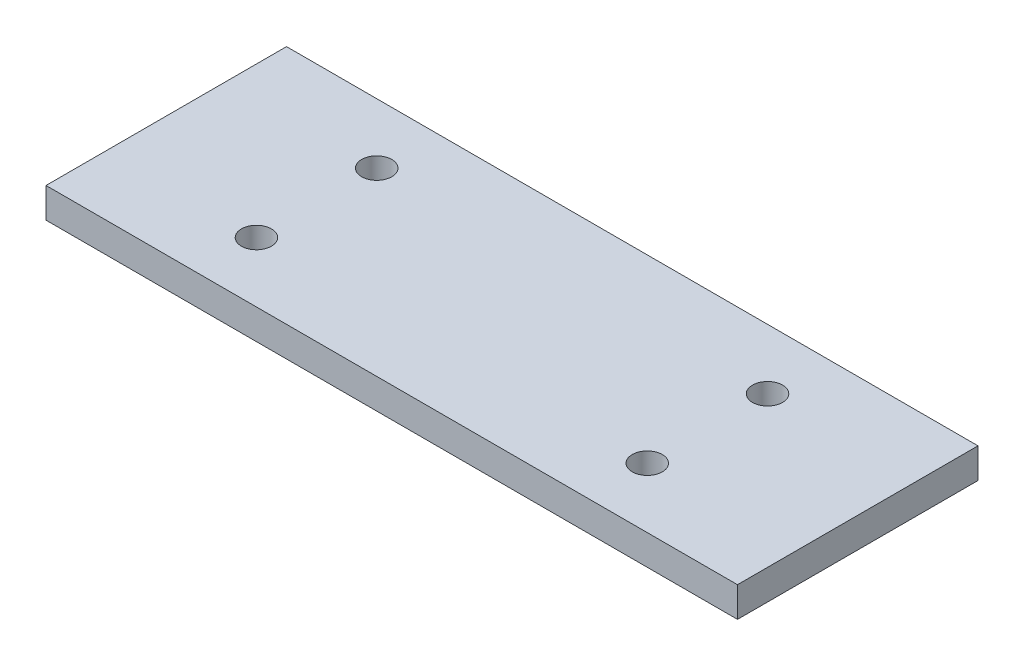
ISO-10303-21;
HEADER;
FILE_DESCRIPTION(('STEP AP214'),'2;1');
FILE_NAME('part.step','',(''),(''),'','','');
FILE_SCHEMA(('AUTOMOTIVE_DESIGN { 1 0 10303 214 1 1 1 1 }'));
ENDSEC;
DATA;
#1=APPLICATION_CONTEXT('core data for automotive mechanical design processes');
#2=APPLICATION_PROTOCOL_DEFINITION('international standard','automotive_design',2000,#1);
#3=PRODUCT_CONTEXT('',#1,'mechanical');
#4=PRODUCT('Part','Part','',(#3));
#5=PRODUCT_RELATED_PRODUCT_CATEGORY('part','',(#4));
#6=PRODUCT_DEFINITION_FORMATION('','',#4);
#7=PRODUCT_DEFINITION_CONTEXT('part definition',#1,'design');
#8=PRODUCT_DEFINITION('design','',#6,#7);
#9=PRODUCT_DEFINITION_SHAPE('','',#8);
#10=(LENGTH_UNIT() NAMED_UNIT(*) SI_UNIT(.MILLI.,.METRE.));
#11=(NAMED_UNIT(*) PLANE_ANGLE_UNIT() SI_UNIT($,.RADIAN.));
#12=(NAMED_UNIT(*) SI_UNIT($,.STERADIAN.) SOLID_ANGLE_UNIT());
#13=UNCERTAINTY_MEASURE_WITH_UNIT(LENGTH_MEASURE(1.E-05),#10,'distance_accuracy_value','');
#14=(GEOMETRIC_REPRESENTATION_CONTEXT(3) GLOBAL_UNCERTAINTY_ASSIGNED_CONTEXT((#13)) GLOBAL_UNIT_ASSIGNED_CONTEXT((#10,
#11,#12)) REPRESENTATION_CONTEXT('',''));
#15=CARTESIAN_POINT('',(0.,0.,0.));
#16=DIRECTION('',(0.,0.,1.));
#17=DIRECTION('',(1.,0.,0.));
#18=AXIS2_PLACEMENT_3D('',#15,#16,#17);
#19=CARTESIAN_POINT('',(0.,2.5,0.));
#20=DIRECTION('',(0.,1.,0.));
#21=DIRECTION('',(0.,0.,1.));
#22=AXIS2_PLACEMENT_3D('',#19,#20,#21);
#23=PLANE('',#22);
#24=CARTESIAN_POINT('',(-32.5,2.5,10.));
#25=DIRECTION('',(0.,1.,0.));
#26=DIRECTION('',(0.,0.,1.));
#27=AXIS2_PLACEMENT_3D('',#24,#25,#26);
#28=CIRCLE('',#27,2.5);
#29=CARTESIAN_POINT('',(-32.5,2.5,12.5));
#30=VERTEX_POINT('',#29);
#31=EDGE_CURVE('E152',#30,#30,#28,.T.);
#32=ORIENTED_EDGE('',*,*,#31,.F.);
#33=EDGE_LOOP('',(#32));
#34=FACE_BOUND('',#33,.T.);
#35=CARTESIAN_POINT('',(-32.5,2.5,-10.));
#36=DIRECTION('',(0.,1.,0.));
#37=DIRECTION('',(0.,0.,1.));
#38=AXIS2_PLACEMENT_3D('',#35,#36,#37);
#39=CIRCLE('',#38,2.5);
#40=CARTESIAN_POINT('',(-32.5,2.5,-7.5));
#41=VERTEX_POINT('',#40);
#42=EDGE_CURVE('E122',#41,#41,#39,.T.);
#43=ORIENTED_EDGE('',*,*,#42,.F.);
#44=EDGE_LOOP('',(#43));
#45=FACE_BOUND('',#44,.T.);
#46=DIRECTION('',(0.,0.,-1.));
#47=VECTOR('',#46,1.);
#48=CARTESIAN_POINT('',(57.5,2.5,-20.));
#49=LINE('',#48,#47);
#50=CARTESIAN_POINT('',(57.5,2.5,20.));
#51=VERTEX_POINT('',#50);
#52=CARTESIAN_POINT('',(57.5,2.5,-20.));
#53=VERTEX_POINT('',#52);
#54=EDGE_CURVE('E102',#51,#53,#49,.T.);
#55=ORIENTED_EDGE('',*,*,#54,.T.);
#56=DIRECTION('',(-1.,0.,0.));
#57=VECTOR('',#56,1.);
#58=CARTESIAN_POINT('',(-57.5,2.5,-20.));
#59=LINE('',#58,#57);
#60=CARTESIAN_POINT('',(-57.5,2.5,-20.));
#61=VERTEX_POINT('',#60);
#62=EDGE_CURVE('E97',#53,#61,#59,.T.);
#63=ORIENTED_EDGE('',*,*,#62,.T.);
#64=DIRECTION('',(0.,0.,1.));
#65=VECTOR('',#64,1.);
#66=CARTESIAN_POINT('',(-57.5,2.5,-20.));
#67=LINE('',#66,#65);
#68=CARTESIAN_POINT('',(-57.5,2.5,20.));
#69=VERTEX_POINT('',#68);
#70=EDGE_CURVE('E100',#61,#69,#67,.T.);
#71=ORIENTED_EDGE('',*,*,#70,.T.);
#72=DIRECTION('',(1.,0.,0.));
#73=VECTOR('',#72,1.);
#74=CARTESIAN_POINT('',(-57.5,2.5,20.));
#75=LINE('',#74,#73);
#76=EDGE_CURVE('E67',#69,#51,#75,.T.);
#77=ORIENTED_EDGE('',*,*,#76,.T.);
#78=EDGE_LOOP('',(#55,#63,#71,#77));
#79=FACE_BOUND('',#78,.T.);
#80=CARTESIAN_POINT('',(32.5,2.5,-10.));
#81=DIRECTION('',(0.,1.,0.));
#82=DIRECTION('',(0.,0.,1.));
#83=AXIS2_PLACEMENT_3D('',#80,#81,#82);
#84=CIRCLE('',#83,2.5);
#85=CARTESIAN_POINT('',(32.5,2.5,-7.50000000000001));
#86=VERTEX_POINT('',#85);
#87=EDGE_CURVE('E144',#86,#86,#84,.T.);
#88=ORIENTED_EDGE('',*,*,#87,.F.);
#89=EDGE_LOOP('',(#88));
#90=FACE_BOUND('',#89,.T.);
#91=CARTESIAN_POINT('',(32.5,2.5,9.99999999999999));
#92=DIRECTION('',(0.,1.,0.));
#93=DIRECTION('',(0.,0.,1.));
#94=AXIS2_PLACEMENT_3D('',#91,#92,#93);
#95=CIRCLE('',#94,2.5);
#96=CARTESIAN_POINT('',(32.5,2.5,12.5));
#97=VERTEX_POINT('',#96);
#98=EDGE_CURVE('E160',#97,#97,#95,.T.);
#99=ORIENTED_EDGE('',*,*,#98,.F.);
#100=EDGE_LOOP('',(#99));
#101=FACE_BOUND('',#100,.T.);
#102=ADVANCED_FACE('F49',(#34,#45,#79,#90,#101),#23,.T.);
#103=CARTESIAN_POINT('',(0.,-2.5,0.));
#104=DIRECTION('',(0.,1.,0.));
#105=DIRECTION('',(0.,0.,1.));
#106=AXIS2_PLACEMENT_3D('',#103,#104,#105);
#107=PLANE('',#106);
#108=DIRECTION('',(0.,0.,-1.));
#109=VECTOR('',#108,1.);
#110=CARTESIAN_POINT('',(57.5,-2.5,-20.));
#111=LINE('',#110,#109);
#112=CARTESIAN_POINT('',(57.5,-2.5,20.));
#113=VERTEX_POINT('',#112);
#114=CARTESIAN_POINT('',(57.5,-2.5,-20.));
#115=VERTEX_POINT('',#114);
#116=EDGE_CURVE('E118',#113,#115,#111,.T.);
#117=ORIENTED_EDGE('',*,*,#116,.F.);
#118=DIRECTION('',(1.,0.,0.));
#119=VECTOR('',#118,1.);
#120=CARTESIAN_POINT('',(-57.5,-2.5,20.));
#121=LINE('',#120,#119);
#122=CARTESIAN_POINT('',(-57.5,-2.5,20.));
#123=VERTEX_POINT('',#122);
#124=EDGE_CURVE('E90',#123,#113,#121,.T.);
#125=ORIENTED_EDGE('',*,*,#124,.F.);
#126=DIRECTION('',(0.,0.,1.));
#127=VECTOR('',#126,1.);
#128=CARTESIAN_POINT('',(-57.5,-2.5,-20.));
#129=LINE('',#128,#127);
#130=CARTESIAN_POINT('',(-57.5,-2.5,-20.));
#131=VERTEX_POINT('',#130);
#132=EDGE_CURVE('E84',#131,#123,#129,.T.);
#133=ORIENTED_EDGE('',*,*,#132,.F.);
#134=DIRECTION('',(-1.,0.,0.));
#135=VECTOR('',#134,1.);
#136=CARTESIAN_POINT('',(-57.5,-2.5,-20.));
#137=LINE('',#136,#135);
#138=EDGE_CURVE('E107',#115,#131,#137,.T.);
#139=ORIENTED_EDGE('',*,*,#138,.F.);
#140=EDGE_LOOP('',(#117,#125,#133,#139));
#141=FACE_BOUND('',#140,.T.);
#142=CARTESIAN_POINT('',(-32.5,-2.5,-10.));
#143=DIRECTION('',(0.,1.,0.));
#144=DIRECTION('',(0.,0.,1.));
#145=AXIS2_PLACEMENT_3D('',#142,#143,#144);
#146=CIRCLE('',#145,2.5);
#147=CARTESIAN_POINT('',(-32.5,-2.5,-7.5));
#148=VERTEX_POINT('',#147);
#149=EDGE_CURVE('E140',#148,#148,#146,.T.);
#150=ORIENTED_EDGE('',*,*,#149,.T.);
#151=EDGE_LOOP('',(#150));
#152=FACE_BOUND('',#151,.T.);
#153=CARTESIAN_POINT('',(32.5,-2.5,-10.));
#154=DIRECTION('',(0.,1.,0.));
#155=DIRECTION('',(0.,0.,1.));
#156=AXIS2_PLACEMENT_3D('',#153,#154,#155);
#157=CIRCLE('',#156,2.5);
#158=CARTESIAN_POINT('',(32.5,-2.5,-7.50000000000001));
#159=VERTEX_POINT('',#158);
#160=EDGE_CURVE('E148',#159,#159,#157,.T.);
#161=ORIENTED_EDGE('',*,*,#160,.T.);
#162=EDGE_LOOP('',(#161));
#163=FACE_BOUND('',#162,.T.);
#164=CARTESIAN_POINT('',(-32.5,-2.5,10.));
#165=DIRECTION('',(0.,1.,0.));
#166=DIRECTION('',(0.,0.,1.));
#167=AXIS2_PLACEMENT_3D('',#164,#165,#166);
#168=CIRCLE('',#167,2.5);
#169=CARTESIAN_POINT('',(-32.5,-2.5,12.5));
#170=VERTEX_POINT('',#169);
#171=EDGE_CURVE('E156',#170,#170,#168,.T.);
#172=ORIENTED_EDGE('',*,*,#171,.T.);
#173=EDGE_LOOP('',(#172));
#174=FACE_BOUND('',#173,.T.);
#175=CARTESIAN_POINT('',(32.5,-2.5,9.99999999999999));
#176=DIRECTION('',(0.,1.,0.));
#177=DIRECTION('',(0.,0.,1.));
#178=AXIS2_PLACEMENT_3D('',#175,#176,#177);
#179=CIRCLE('',#178,2.5);
#180=CARTESIAN_POINT('',(32.5,-2.5,12.5));
#181=VERTEX_POINT('',#180);
#182=EDGE_CURVE('E164',#181,#181,#179,.T.);
#183=ORIENTED_EDGE('',*,*,#182,.T.);
#184=EDGE_LOOP('',(#183));
#185=FACE_BOUND('',#184,.T.);
#186=ADVANCED_FACE('F135',(#141,#152,#163,#174,#185),#107,.F.);
#187=CARTESIAN_POINT('',(57.5,2.5,-20.));
#188=DIRECTION('',(-1.,0.,0.));
#189=DIRECTION('',(0.,0.,1.));
#190=AXIS2_PLACEMENT_3D('',#187,#188,#189);
#191=PLANE('',#190);
#192=ORIENTED_EDGE('',*,*,#116,.T.);
#193=DIRECTION('',(0.,-1.,0.));
#194=VECTOR('',#193,1.);
#195=CARTESIAN_POINT('',(57.5,2.5,-20.));
#196=LINE('',#195,#194);
#197=EDGE_CURVE('E11',#53,#115,#196,.T.);
#198=ORIENTED_EDGE('',*,*,#197,.F.);
#199=ORIENTED_EDGE('',*,*,#54,.F.);
#200=DIRECTION('',(0.,-1.,0.));
#201=VECTOR('',#200,1.);
#202=CARTESIAN_POINT('',(57.5,2.5,20.));
#203=LINE('',#202,#201);
#204=EDGE_CURVE('E114',#51,#113,#203,.T.);
#205=ORIENTED_EDGE('',*,*,#204,.T.);
#206=EDGE_LOOP('',(#192,#198,#199,#205));
#207=FACE_BOUND('',#206,.T.);
#208=ADVANCED_FACE('F51',(#207),#191,.F.);
#209=CARTESIAN_POINT('',(-57.5,2.5,-20.));
#210=DIRECTION('',(0.,0.,1.));
#211=DIRECTION('',(1.,0.,0.));
#212=AXIS2_PLACEMENT_3D('',#209,#210,#211);
#213=PLANE('',#212);
#214=ORIENTED_EDGE('',*,*,#138,.T.);
#215=DIRECTION('',(0.,-1.,0.));
#216=VECTOR('',#215,1.);
#217=CARTESIAN_POINT('',(-57.5,2.5,-20.));
#218=LINE('',#217,#216);
#219=EDGE_CURVE('E59',#61,#131,#218,.T.);
#220=ORIENTED_EDGE('',*,*,#219,.F.);
#221=ORIENTED_EDGE('',*,*,#62,.F.);
#222=ORIENTED_EDGE('',*,*,#197,.T.);
#223=EDGE_LOOP('',(#214,#220,#221,#222));
#224=FACE_BOUND('',#223,.T.);
#225=ADVANCED_FACE('F106',(#224),#213,.F.);
#226=CARTESIAN_POINT('',(-57.5,2.5,-20.));
#227=DIRECTION('',(1.,0.,0.));
#228=DIRECTION('',(0.,0.,-1.));
#229=AXIS2_PLACEMENT_3D('',#226,#227,#228);
#230=PLANE('',#229);
#231=ORIENTED_EDGE('',*,*,#132,.T.);
#232=DIRECTION('',(0.,-1.,0.));
#233=VECTOR('',#232,1.);
#234=CARTESIAN_POINT('',(-57.5,2.5,20.));
#235=LINE('',#234,#233);
#236=EDGE_CURVE('E109',#69,#123,#235,.T.);
#237=ORIENTED_EDGE('',*,*,#236,.F.);
#238=ORIENTED_EDGE('',*,*,#70,.F.);
#239=ORIENTED_EDGE('',*,*,#219,.T.);
#240=EDGE_LOOP('',(#231,#237,#238,#239));
#241=FACE_BOUND('',#240,.T.);
#242=ADVANCED_FACE('F110',(#241),#230,.F.);
#243=CARTESIAN_POINT('',(-57.5,2.5,20.));
#244=DIRECTION('',(0.,0.,-1.));
#245=DIRECTION('',(-1.,0.,0.));
#246=AXIS2_PLACEMENT_3D('',#243,#244,#245);
#247=PLANE('',#246);
#248=ORIENTED_EDGE('',*,*,#124,.T.);
#249=ORIENTED_EDGE('',*,*,#204,.F.);
#250=ORIENTED_EDGE('',*,*,#76,.F.);
#251=ORIENTED_EDGE('',*,*,#236,.T.);
#252=EDGE_LOOP('',(#248,#249,#250,#251));
#253=FACE_BOUND('',#252,.T.);
#254=ADVANCED_FACE('F132',(#253),#247,.F.);
#255=CARTESIAN_POINT('',(-32.5,2.5,-10.));
#256=DIRECTION('',(0.,-1.,0.));
#257=DIRECTION('',(0.,0.,-1.));
#258=AXIS2_PLACEMENT_3D('',#255,#256,#257);
#259=CYLINDRICAL_SURFACE('',#258,2.5);
#260=ORIENTED_EDGE('',*,*,#42,.T.);
#261=EDGE_LOOP('',(#260));
#262=FACE_BOUND('',#261,.T.);
#263=ORIENTED_EDGE('',*,*,#149,.F.);
#264=EDGE_LOOP('',(#263));
#265=FACE_BOUND('',#264,.T.);
#266=ADVANCED_FACE('F185',(#262,#265),#259,.F.);
#267=CARTESIAN_POINT('',(32.5,2.5,-10.));
#268=DIRECTION('',(0.,-1.,0.));
#269=DIRECTION('',(0.,0.,-1.));
#270=AXIS2_PLACEMENT_3D('',#267,#268,#269);
#271=CYLINDRICAL_SURFACE('',#270,2.5);
#272=ORIENTED_EDGE('',*,*,#87,.T.);
#273=EDGE_LOOP('',(#272));
#274=FACE_BOUND('',#273,.T.);
#275=ORIENTED_EDGE('',*,*,#160,.F.);
#276=EDGE_LOOP('',(#275));
#277=FACE_BOUND('',#276,.T.);
#278=ADVANCED_FACE('F253',(#274,#277),#271,.F.);
#279=CARTESIAN_POINT('',(-32.5,2.5,10.));
#280=DIRECTION('',(0.,-1.,0.));
#281=DIRECTION('',(0.,0.,-1.));
#282=AXIS2_PLACEMENT_3D('',#279,#280,#281);
#283=CYLINDRICAL_SURFACE('',#282,2.5);
#284=ORIENTED_EDGE('',*,*,#31,.T.);
#285=EDGE_LOOP('',(#284));
#286=FACE_BOUND('',#285,.T.);
#287=ORIENTED_EDGE('',*,*,#171,.F.);
#288=EDGE_LOOP('',(#287));
#289=FACE_BOUND('',#288,.T.);
#290=ADVANCED_FACE('F264',(#286,#289),#283,.F.);
#291=CARTESIAN_POINT('',(32.5,2.5,9.99999999999999));
#292=DIRECTION('',(0.,-1.,0.));
#293=DIRECTION('',(0.,0.,-1.));
#294=AXIS2_PLACEMENT_3D('',#291,#292,#293);
#295=CYLINDRICAL_SURFACE('',#294,2.5);
#296=ORIENTED_EDGE('',*,*,#98,.T.);
#297=EDGE_LOOP('',(#296));
#298=FACE_BOUND('',#297,.T.);
#299=ORIENTED_EDGE('',*,*,#182,.F.);
#300=EDGE_LOOP('',(#299));
#301=FACE_BOUND('',#300,.T.);
#302=ADVANCED_FACE('F172',(#298,#301),#295,.F.);
#303=CLOSED_SHELL('',(#102,#186,#208,#225,#242,#254,#266,#278,#290,#302));
#304=MANIFOLD_SOLID_BREP('B2',#303);
#305=ADVANCED_BREP_SHAPE_REPRESENTATION('',(#18,#304),#14);
#306=SHAPE_DEFINITION_REPRESENTATION(#9,#305);
ENDSEC;
END-ISO-10303-21;
